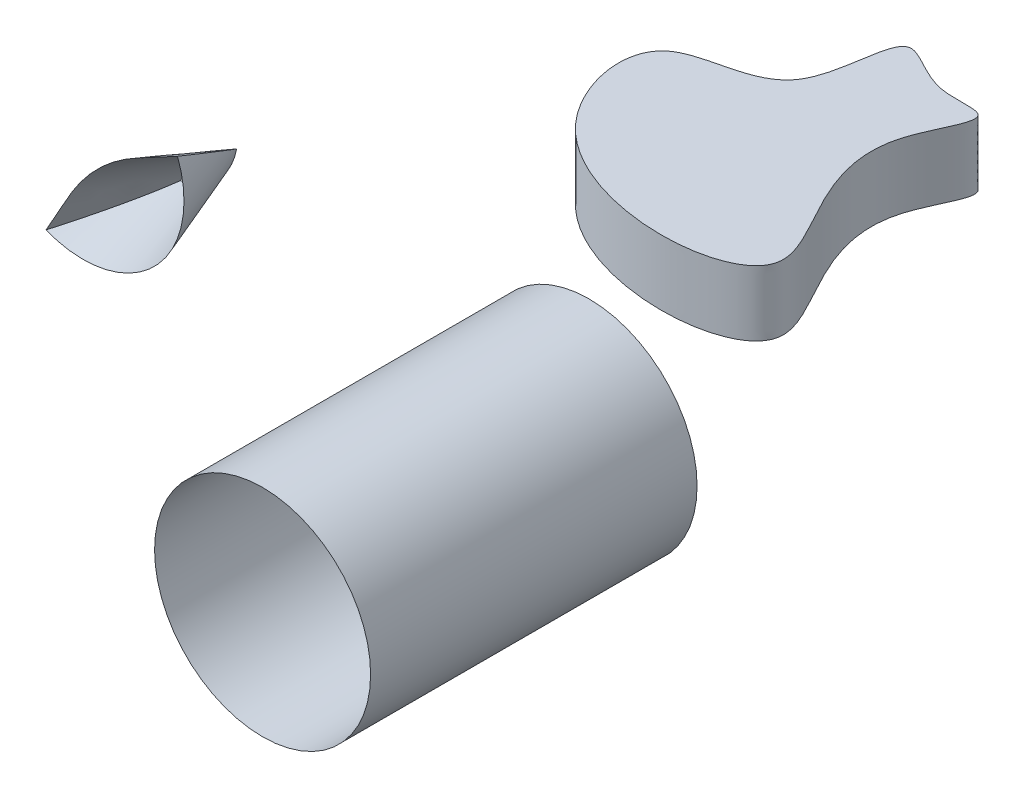
ISO-10303-21;
HEADER;
FILE_DESCRIPTION(('STEP AP214'),'2;1');
FILE_NAME('part.step','',(''),(''),'','','');
FILE_SCHEMA(('AUTOMOTIVE_DESIGN { 1 0 10303 214 1 1 1 1 }'));
ENDSEC;
DATA;
#1=APPLICATION_CONTEXT('core data for automotive mechanical design processes');
#2=APPLICATION_PROTOCOL_DEFINITION('international standard','automotive_design',2000,#1);
#3=PRODUCT_CONTEXT('',#1,'mechanical');
#4=PRODUCT('Part','Part','',(#3));
#5=PRODUCT_RELATED_PRODUCT_CATEGORY('part','',(#4));
#6=PRODUCT_DEFINITION_FORMATION('','',#4);
#7=PRODUCT_DEFINITION_CONTEXT('part definition',#1,'design');
#8=PRODUCT_DEFINITION('design','',#6,#7);
#9=PRODUCT_DEFINITION_SHAPE('','',#8);
#10=(LENGTH_UNIT() NAMED_UNIT(*) SI_UNIT(.MILLI.,.METRE.));
#11=(NAMED_UNIT(*) PLANE_ANGLE_UNIT() SI_UNIT($,.RADIAN.));
#12=(NAMED_UNIT(*) SI_UNIT($,.STERADIAN.) SOLID_ANGLE_UNIT());
#13=UNCERTAINTY_MEASURE_WITH_UNIT(LENGTH_MEASURE(1.E-05),#10,'distance_accuracy_value','');
#14=(GEOMETRIC_REPRESENTATION_CONTEXT(3) GLOBAL_UNCERTAINTY_ASSIGNED_CONTEXT((#13)) GLOBAL_UNIT_ASSIGNED_CONTEXT((#10,
#11,#12)) REPRESENTATION_CONTEXT('',''));
#15=CARTESIAN_POINT('',(0.,0.,0.));
#16=DIRECTION('',(0.,0.,1.));
#17=DIRECTION('',(1.,0.,0.));
#18=AXIS2_PLACEMENT_3D('',#15,#16,#17);
#19=CARTESIAN_POINT('',(-49.1507970621573,10.,-113.553148675584));
#20=CARTESIAN_POINT('',(-55.2439623804513,10.,-104.254853534053));
#21=CARTESIAN_POINT('',(-87.6743060870905,10.,-108.685326320553));
#22=CARTESIAN_POINT('',(-74.0903427954532,10.,-45.4823847950219));
#23=CARTESIAN_POINT('',(27.8354236460612,10.,-48.5070370287409));
#24=CARTESIAN_POINT('',(-32.4402889943373,10.,-97.9136858698389));
#25=CARTESIAN_POINT('',(-5.83480480371106,10.,-134.922849357029));
#26=CARTESIAN_POINT('',(-27.4973487823059,10.,-130.100372673364));
#27=CARTESIAN_POINT('',(-46.7711085310313,10.,-147.96430517599));
#28=CARTESIAN_POINT('',(-43.9525990307988,10.,-121.485705396896));
#29=CARTESIAN_POINT('',(-49.1507970621573,10.,-113.553148675584));
#30=B_SPLINE_CURVE_WITH_KNOTS('',3,(#19,#20,#21,#22,#23,#24,#25,#26,#27,#28,#29),.UNSPECIFIED.,
.T.,.F.,(4,1,1,1,1,1,1,1,4),(0.,0.119358610222687,0.247934810582562,0.506564167676508,
0.71354229957892,0.78558169847103,0.834101116400094,0.898172844445492,1.),.UNSPECIFIED.);
#31=DIRECTION('',(0.,-1.,0.));
#32=VECTOR('',#31,1.);
#33=SURFACE_OF_LINEAR_EXTRUSION('',#30,#32);
#34=CARTESIAN_POINT('',(-49.1507970621573,10.,-113.553148675584));
#35=VERTEX_POINT('',#34);
#36=EDGE_CURVE('E11',#35,#35,#30,.T.);
#37=ORIENTED_EDGE('',*,*,#36,.F.);
#38=EDGE_LOOP('',(#37));
#39=FACE_BOUND('',#38,.T.);
#40=CARTESIAN_POINT('',(-49.1507970621573,-10.,-113.553148675584));
#41=CARTESIAN_POINT('',(-55.2439623804513,-10.,-104.254853534053));
#42=CARTESIAN_POINT('',(-87.6743060870905,-10.,-108.685326320553));
#43=CARTESIAN_POINT('',(-74.0903427954532,-10.,-45.4823847950219));
#44=CARTESIAN_POINT('',(27.8354236460612,-10.,-48.5070370287409));
#45=CARTESIAN_POINT('',(-32.4402889943373,-10.,-97.9136858698389));
#46=CARTESIAN_POINT('',(-5.83480480371106,-10.,-134.922849357029));
#47=CARTESIAN_POINT('',(-27.4973487823059,-10.,-130.100372673364));
#48=CARTESIAN_POINT('',(-46.7711085310313,-10.,-147.96430517599));
#49=CARTESIAN_POINT('',(-43.9525990307988,-10.,-121.485705396896));
#50=CARTESIAN_POINT('',(-49.1507970621573,-10.,-113.553148675584));
#51=B_SPLINE_CURVE_WITH_KNOTS('',3,(#40,#41,#42,#43,#44,#45,#46,#47,#48,#49,#50),.UNSPECIFIED.,
.T.,.F.,(4,1,1,1,1,1,1,1,4),(0.,0.119358610222687,0.247934810582562,0.506564167676508,
0.71354229957892,0.78558169847103,0.834101116400094,0.898172844445492,1.),.UNSPECIFIED.);
#52=CARTESIAN_POINT('',(-49.1507970621573,-10.,-113.553148675584));
#53=VERTEX_POINT('',#52);
#54=EDGE_CURVE('E57',#53,#53,#51,.T.);
#55=ORIENTED_EDGE('',*,*,#54,.T.);
#56=EDGE_LOOP('',(#55));
#57=FACE_BOUND('',#56,.T.);
#58=ADVANCED_FACE('F48',(#39,#57),#33,.F.);
#59=CARTESIAN_POINT('',(-4.4064244063763,10.,-60.2147059790731));
#60=DIRECTION('',(0.,1.,0.));
#61=DIRECTION('',(0.,0.,1.));
#62=AXIS2_PLACEMENT_3D('',#59,#60,#61);
#63=PLANE('',#62);
#64=ORIENTED_EDGE('',*,*,#36,.T.);
#65=EDGE_LOOP('',(#64));
#66=FACE_BOUND('',#65,.T.);
#67=ADVANCED_FACE('F71',(#66),#63,.T.);
#68=CARTESIAN_POINT('',(-4.4064244063763,-10.,-60.2147059790731));
#69=DIRECTION('',(0.,1.,0.));
#70=DIRECTION('',(0.,0.,1.));
#71=AXIS2_PLACEMENT_3D('',#68,#69,#70);
#72=PLANE('',#71);
#73=ORIENTED_EDGE('',*,*,#54,.F.);
#74=EDGE_LOOP('',(#73));
#75=FACE_BOUND('',#74,.T.);
#76=ADVANCED_FACE('F69',(#75),#72,.F.);
#77=CLOSED_SHELL('',(#58,#67,#76));
#78=MANIFOLD_SOLID_BREP('B2',#77);
#79=CARTESIAN_POINT('',(-142.392982890298,-5.58823275927255,31.2));
#80=CARTESIAN_POINT('',(-139.952744756205,-1.25005963740605,31.2));
#81=CARTESIAN_POINT('',(-137.512506622112,3.08811348446046,31.2));
#82=CARTESIAN_POINT('',(-135.072268488019,7.42628660632696,31.2));
#83=CARTESIAN_POINT('',(-133.783813512833,9.71685844191598,31.2));
#84=CARTESIAN_POINT('',(-132.358250288047,11.9015968386679,31.2));
#85=CARTESIAN_POINT('',(-129.233807306659,16.0300214656698,31.2));
#86=CARTESIAN_POINT('',(-127.534788565224,17.9735629796669,31.2));
#87=CARTESIAN_POINT('',(-123.878042005202,21.5895786550206,31.2));
#88=CARTESIAN_POINT('',(-121.920507966322,23.2617555169876,31.2));
#89=CARTESIAN_POINT('',(-117.77440532527,26.3128406256738,31.2));
#90=CARTESIAN_POINT('',(-115.586059553688,27.6917158353275,31.2));
#91=CARTESIAN_POINT('',(-113.298440704203,28.9200612850704,31.2));
#92=CARTESIAN_POINT('',(-108.933573964078,31.2637927157564,31.2));
#93=CARTESIAN_POINT('',(-104.568707223952,33.6075241464424,31.2));
#94=CARTESIAN_POINT('',(-100.203840483827,35.9512555771284,31.2));
#95=CARTESIAN_POINT('',(-131.123550550181,-8.71660057397694,0.));
#96=CARTESIAN_POINT('',(-129.140628436737,-5.19142846300423,0.));
#97=CARTESIAN_POINT('',(-127.157706323292,-1.66625635203152,0.));
#98=CARTESIAN_POINT('',(-125.174784209848,1.85891575894119,0.));
#99=CARTESIAN_POINT('',(-124.127793825271,3.72021998220922,0.));
#100=CARTESIAN_POINT('',(-122.983208084269,5.47153853985969,0.));
#101=CARTESIAN_POINT('',(-120.498845889052,8.75420432402315,0.));
#102=CARTESIAN_POINT('',(-119.159069435075,10.2855515505193,0.));
#103=CARTESIAN_POINT('',(-116.284325813925,13.1282746723414,0.));
#104=CARTESIAN_POINT('',(-114.74935864692,14.4396505676646,0.));
#105=CARTESIAN_POINT('',(-111.484233599815,16.8424310271515,0.));
#106=CARTESIAN_POINT('',(-109.754075719801,17.9338355912992,0.));
#107=CARTESIAN_POINT('',(-107.926322483262,18.9152544898744,0.));
#108=CARTESIAN_POINT('',(-104.438897419807,20.7878403489592,0.));
#109=CARTESIAN_POINT('',(-100.951472356352,22.660426208044,0.));
#110=CARTESIAN_POINT('',(-97.4640472928973,24.5330120671289,0.));
#111=B_SPLINE_SURFACE_WITH_KNOTS('',1,3,((#79,#80,#81,#82,#83,#84,#85,#86,#87,#88,#89,#90,#91,
#92,#93,#94),(#95,#96,#97,#98,#99,#100,#101,#102,#103,#104,#105,#106,#107,#108,#109,#110)),
.UNSPECIFIED.,.F.,.F.,.F.,(2,2),(4,3,2,2,2,3,4),(0.,1.),(0.0373522960338951,0.227568061519548,
0.328002705980897,0.428437350442246,0.528871994903595,0.629306639364944,0.820939891234852),.UNSPECIFIED.);
#112=CARTESIAN_POINT('',(-99.7638494216745,34.0392794720783,26.));
#113=CARTESIAN_POINT('',(-100.464015976382,33.6633224363297,26.));
#114=CARTESIAN_POINT('',(-101.164182531095,33.2873654005934,26.));
#115=CARTESIAN_POINT('',(-102.564439336584,32.5354923008044,26.));
#116=CARTESIAN_POINT('',(-103.264529587359,32.1595762367519,26.));
#117=CARTESIAN_POINT('',(-104.314645852685,31.5957124022844,26.));
#118=CARTESIAN_POINT('',(-104.66467186724,31.4077646318787,26.));
#119=CARTESIAN_POINT('',(-105.364723853206,31.0318691142813,26.));
#120=CARTESIAN_POINT('',(-105.714749824617,30.8439213670896,26.));
#121=CARTESIAN_POINT('',(-106.41687845419,30.4669107878488,26.));
#122=CARTESIAN_POINT('',(-106.768981112352,30.277847955799,26.));
#123=CARTESIAN_POINT('',(-107.473186588512,29.8997222065604,26.));
#124=CARTESIAN_POINT('',(-107.825289406509,29.7106592893717,26.));
#125=CARTESIAN_POINT('',(-108.529514505176,29.3325230018822,26.));
#126=CARTESIAN_POINT('',(-108.881636785846,29.1434496315812,26.));
#127=CARTESIAN_POINT('',(-109.409819902372,28.8598397467809,26.));
#128=CARTESIAN_POINT('',(-109.585880736739,28.7653032295018,26.));
#129=CARTESIAN_POINT('',(-109.938002419791,28.5762301742117,26.));
#130=CARTESIAN_POINT('',(-110.114063268476,28.4816936362008,26.));
#131=CARTESIAN_POINT('',(-110.466203910022,28.2926104378211,26.));
#132=CARTESIAN_POINT('',(-110.642283702884,28.1980637774565,26.));
#133=CARTESIAN_POINT('',(-110.994443137363,28.0089703518088,26.));
#134=CARTESIAN_POINT('',(-111.170522778978,27.9144235865258,26.));
#135=CARTESIAN_POINT('',(-111.434642968054,27.7726035694688,26.));
#136=CARTESIAN_POINT('',(-111.522683407008,27.7253301154358,26.));
#137=CARTESIAN_POINT('',(-111.698763880386,27.6307824755506,26.));
#138=CARTESIAN_POINT('',(-111.786803914809,27.5835082896983,26.));
#139=CARTESIAN_POINT('',(-111.962885617319,27.4889626632438,26.));
#140=CARTESIAN_POINT('',(-112.050927285407,27.4416912226455,26.));
#141=CARTESIAN_POINT('',(-112.182985572625,27.3707761693654,26.));
#142=CARTESIAN_POINT('',(-112.227004306641,27.3471364988844,26.));
#143=CARTESIAN_POINT('',(-112.315049484697,27.2998715179677,26.));
#144=CARTESIAN_POINT('',(-112.359075928738,27.2762462075336,26.));
#145=CARTESIAN_POINT('',(-112.439432429802,27.2330611389107,26.));
#146=CARTESIAN_POINT('',(-112.475767164015,27.2135100991178,26.));
#147=CARTESIAN_POINT('',(-112.548385601054,27.174313560548,26.));
#148=CARTESIAN_POINT('',(-112.584669303941,27.1546680618838,26.));
#149=CARTESIAN_POINT('',(-112.69345458176,27.0956110626666,26.));
#150=CARTESIAN_POINT('',(-112.765890674369,27.0560788716824,26.));
#151=CARTESIAN_POINT('',(-112.910578963505,26.9766825666795,26.));
#152=CARTESIAN_POINT('',(-112.982831163453,26.9368184588961,26.));
#153=CARTESIAN_POINT('',(-113.127152967638,26.8567605053247,26.));
#154=CARTESIAN_POINT('',(-113.199222571113,26.8165666581644,26.));
#155=CARTESIAN_POINT('',(-113.415114344156,26.6955118991166,26.));
#156=CARTESIAN_POINT('',(-113.558659347161,26.614155891594,26.));
#157=CARTESIAN_POINT('',(-113.844996410206,26.4501245704001,26.));
#158=CARTESIAN_POINT('',(-113.987788457652,26.3674492347523,26.));
#159=CARTESIAN_POINT('',(-114.272580080364,26.2007947771054,26.));
#160=CARTESIAN_POINT('',(-114.414579775702,26.1168158603689,26.));
#161=CARTESIAN_POINT('',(-114.697792079352,25.9475446709138,26.));
#162=CARTESIAN_POINT('',(-114.839004693634,25.8622524081744,26.));
#163=CARTESIAN_POINT('',(-115.261435513112,25.6044107921974,26.));
#164=CARTESIAN_POINT('',(-115.541455151852,25.4298916632077,26.));
#165=CARTESIAN_POINT('',(-116.097699032195,25.0759238764394,26.));
#166=CARTESIAN_POINT('',(-116.373928853974,24.8964839816988,26.));
#167=CARTESIAN_POINT('',(-116.923018490017,24.532373952616,26.));
#168=CARTESIAN_POINT('',(-117.195877457577,24.3477025410774,26.));
#169=CARTESIAN_POINT('',(-117.738070683039,23.9731766845659,26.));
#170=CARTESIAN_POINT('',(-118.007404452887,23.7833215329141,26.));
#171=CARTESIAN_POINT('',(-118.542393789021,23.3984801107552,26.));
#172=CARTESIAN_POINT('',(-118.808049224343,23.2034936582644,26.));
#173=CARTESIAN_POINT('',(-119.423800145611,22.7423556498328,26.));
#174=CARTESIAN_POINT('',(-119.772412132999,22.4742192728826,26.));
#175=CARTESIAN_POINT('',(-120.462567977438,21.9291011191702,26.));
#176=CARTESIAN_POINT('',(-120.80411281412,21.6521205820858,26.));
#177=CARTESIAN_POINT('',(-121.479912737031,21.089473665267,26.));
#178=CARTESIAN_POINT('',(-121.814168577724,20.8038081918856,26.));
#179=CARTESIAN_POINT('',(-122.475267708306,20.2238806683032,26.));
#180=CARTESIAN_POINT('',(-122.802109346291,19.92961673512,26.));
#181=CARTESIAN_POINT('',(-123.448118463044,19.3327106990498,26.));
#182=CARTESIAN_POINT('',(-123.767285097069,19.0300676817417,26.));
#183=CARTESIAN_POINT('',(-124.397762516268,18.4165589159116,26.));
#184=CARTESIAN_POINT('',(-124.709071349019,18.1056911623374,26.));
#185=CARTESIAN_POINT('',(-125.42674561671,17.3703504609132,26.));
#186=CARTESIAN_POINT('',(-125.829938276564,16.9427737381747,26.));
#187=CARTESIAN_POINT('',(-126.621604947176,16.074069597164,26.));
#188=CARTESIAN_POINT('',(-127.010076166793,15.6329396376627,26.));
#189=CARTESIAN_POINT('',(-127.771916707112,14.7378695789965,26.));
#190=CARTESIAN_POINT('',(-128.145286893402,14.2839302166022,26.));
#191=CARTESIAN_POINT('',(-128.876566812825,13.3640253983401,26.));
#192=CARTESIAN_POINT('',(-129.234481777973,12.8980640989261,26.));
#193=CARTESIAN_POINT('',(-129.935637531236,11.9535546865491,26.));
#194=CARTESIAN_POINT('',(-130.278842661597,11.4749800800346,26.));
#195=CARTESIAN_POINT('',(-130.781930379693,10.7490427095808,26.));
#196=CARTESIAN_POINT('',(-130.947672245677,10.505718775193,26.));
#197=CARTESIAN_POINT('',(-131.275257567913,10.0164537015825,26.));
#198=CARTESIAN_POINT('',(-131.43710098576,9.77051253661087,26.));
#199=CARTESIAN_POINT('',(-131.75690832097,9.27607438834147,26.));
#200=CARTESIAN_POINT('',(-131.914871701287,9.02757705791688,26.));
#201=CARTESIAN_POINT('',(-132.226898390214,8.52815127647564,26.));
#202=CARTESIAN_POINT('',(-132.380961778143,8.27722287504633,26.));
#203=CARTESIAN_POINT('',(-132.609155060198,7.89904096099538,26.));
#204=CARTESIAN_POINT('',(-132.684745132007,7.77266617763846,26.));
#205=CARTESIAN_POINT('',(-132.834954127431,7.51934126315739,26.));
#206=CARTESIAN_POINT('',(-132.909573055965,7.3923911349518,26.));
#207=CARTESIAN_POINT('',(-133.057836807797,7.13792068009886,26.));
#208=CARTESIAN_POINT('',(-133.131481615856,7.01040034457231,26.));
#209=CARTESIAN_POINT('',(-133.24123414935,6.81871066146994,26.));
#210=CARTESIAN_POINT('',(-133.277699304641,6.75474574286233,26.));
#211=CARTESIAN_POINT('',(-133.350364790226,6.62666558099598,26.));
#212=CARTESIAN_POINT('',(-133.386565120271,6.56255033759592,26.));
#213=CARTESIAN_POINT('',(-133.442851679626,6.46257755837624,26.));
#214=CARTESIAN_POINT('',(-133.462991381048,6.42675005706371,26.));
#215=CARTESIAN_POINT('',(-133.50328345453,6.35510219735455,26.));
#216=CARTESIAN_POINT('',(-133.523435826582,6.31928183895399,26.));
#217=CARTESIAN_POINT('',(-133.583889383807,6.21181894743409,26.));
#218=CARTESIAN_POINT('',(-133.624187088159,6.14017445918802,26.));
#219=CARTESIAN_POINT('',(-133.704784646783,5.99688746998347,26.));
#220=CARTESIAN_POINT('',(-133.745084501034,5.92524496901345,26.));
#221=CARTESIAN_POINT('',(-133.825683582881,5.78195955917424,26.));
#222=CARTESIAN_POINT('',(-133.865982810476,5.71031665030482,26.));
#223=CARTESIAN_POINT('',(-133.986868738475,5.49540923884565,26.));
#224=CARTESIAN_POINT('',(-134.067455617414,5.35214483653635,26.));
#225=CARTESIAN_POINT('',(-134.228629443787,5.06561561171163,26.));
#226=CARTESIAN_POINT('',(-134.309216391221,4.92235078919605,26.));
#227=CARTESIAN_POINT('',(-134.470383648791,4.63583302357462,26.));
#228=CARTESIAN_POINT('',(-134.550963958924,4.49258008046719,26.));
#229=CARTESIAN_POINT('',(-134.712124517721,4.20607428261393,26.));
#230=CARTESIAN_POINT('',(-134.792704766386,4.06282142786812,26.));
#231=CARTESIAN_POINT('',(-135.034443523554,3.63306640504076,26.));
#232=CARTESIAN_POINT('',(-135.195602034511,3.3465642383377,26.));
#233=CARTESIAN_POINT('',(-135.517694176364,2.77395968502174,26.));
#234=CARTESIAN_POINT('',(-135.678627807261,2.4878572984102,26.));
#235=CARTESIAN_POINT('',(-136.000501656427,1.91564081547775,26.));
#236=CARTESIAN_POINT('',(-136.161441874695,1.62952671915684,26.));
#237=CARTESIAN_POINT('',(-136.483326399388,1.05729125843566,26.));
#238=CARTESIAN_POINT('',(-136.644270705812,0.771169894035378,26.));
#239=CARTESIAN_POINT('',(-136.966160908355,0.198924339207895,26.));
#240=CARTESIAN_POINT('',(-137.127106804472,-0.0871998512193073,26.));
#241=CARTESIAN_POINT('',(-137.71672366628,-1.13540083875402,26.));
#242=CARTESIAN_POINT('',(-138.145394631954,-1.89747763586998,26.));
#243=CARTESIAN_POINT('',(-139.002731188425,-3.42162167480272,26.));
#244=CARTESIAN_POINT('',(-139.431396779221,-4.1836889166195,26.));
#245=CARTESIAN_POINT('',(-140.288723659251,-5.70781575308544,26.));
#246=CARTESIAN_POINT('',(-140.717384948485,-6.46987534773461,26.));
#247=CARTESIAN_POINT('',(-141.574704298719,-7.99398879798833,26.));
#248=CARTESIAN_POINT('',(-142.00336235972,-8.7560426535929,26.));
#249=CARTESIAN_POINT('',(-142.860676326816,-10.2801465338828,26.));
#250=CARTESIAN_POINT('',(-143.289332232911,-11.0421965585681,26.));
#251=CARTESIAN_POINT('',(-144.146642963522,-12.5662946851442,26.));
#252=CARTESIAN_POINT('',(-144.575297788037,-13.328342787035,26.));
#253=CARTESIAN_POINT('',(-145.434255177032,-14.855368287395,26.));
#254=CARTESIAN_POINT('',(-145.86455774151,-15.6203456858642,26.));
#255=CARTESIAN_POINT('',(-146.725163947904,-17.150302398234,26.));
#256=CARTESIAN_POINT('',(-147.155467589819,-17.9152817121345,26.));
#257=CARTESIAN_POINT('',(-148.01607703684,-19.445244185581,26.));
#258=CARTESIAN_POINT('',(-148.446382841945,-20.210227345127,26.));
#259=CARTESIAN_POINT('',(-149.306997701096,-21.7401994400783,26.));
#260=CARTESIAN_POINT('',(-149.737306755143,-22.5051883754836,26.));
#261=CARTESIAN_POINT('',(-150.597929197931,-24.0351739523677,26.));
#262=CARTESIAN_POINT('',(-151.028242586672,-24.8001705938464,26.));
#263=CARTESIAN_POINT('',(-151.888874784601,-26.3301735130913,26.));
#264=CARTESIAN_POINT('',(-152.319193593789,-27.0951797908574,26.));
#265=CARTESIAN_POINT('',(-152.749512402976,-27.8601860686235,26.));
#266=B_SPLINE_CURVE_WITH_KNOTS('',3,(#112,#113,#114,#115,#116,#117,#118,#119,#120,#121,#122,
#123,#124,#125,#126,#127,#128,#129,#130,#131,#132,#133,#134,#135,#136,#137,#138,#139,#140,#141,
#142,#143,#144,#145,#146,#147,#148,#149,#150,#151,#152,#153,#154,#155,#156,#157,#158,#159,#160,
#161,#162,#163,#164,#165,#166,#167,#168,#169,#170,#171,#172,#173,#174,#175,#176,#177,#178,#179,
#180,#181,#182,#183,#184,#185,#186,#187,#188,#189,#190,#191,#192,#193,#194,#195,#196,#197,#198,
#199,#200,#201,#202,#203,#204,#205,#206,#207,#208,#209,#210,#211,#212,#213,#214,#215,#216,#217,
#218,#219,#220,#221,#222,#223,#224,#225,#226,#227,#228,#229,#230,#231,#232,#233,#234,#235,#236,
#237,#238,#239,#240,#241,#242,#243,#244,#245,#246,#247,#248,#249,#250,#251,#252,#253,#254,#255,
#256,#257,#258,#259,#260,#261,#262,#263,#264,#265),.UNSPECIFIED.,.F.,.F.,(4,2,2,2,2,2,2,2,2,2,2,
2,2,2,2,2,2,2,2,2,2,2,2,2,2,2,2,2,2,2,2,2,2,2,2,2,2,2,2,2,2,2,2,2,2,2,2,2,2,2,2,2,2,2,2,2,2,2,2,
2,2,2,2,2,2,2,2,2,2,2,2,2,2,2,2,2,4),(0.,2.38415437284063,4.76804892126061,5.95993112072214,
7.15181317320403,8.35076660312841,9.54972057634054,10.7487408260033,11.3482499038967,
11.947759049046,12.5473326308626,13.1469059616394,13.446694362411,13.7464827316473,
14.0462715262626,14.1961659741683,14.346060438569,14.4698428399302,14.5936250934464,
14.84118841364,15.0887470934783,15.3363068040764,15.8312897936396,16.3262810368833,
16.8211951135653,17.3161054315599,18.3058966779263,19.2940270728942,20.2824008201413,
21.2709099879598,22.2594542610284,23.5787136643079,24.8977889530328,26.2167270534846,
27.5359561862733,28.8553298602947,30.1750281941931,31.9377548904539,33.7008141392441,
35.4637721863607,37.2261286687205,38.9925400587102,39.875737904338,40.7589444471448,
41.6422725556846,42.5255826844736,42.9673483287562,43.4091117345842,43.8508820436255,
44.0717683061208,44.2926547763481,44.4159550640892,44.5392552838152,44.7858552454368,
45.0324531676243,45.2790512360664,45.7721743505345,46.265298664741,46.7583821554351,
47.2514653247007,48.2376194782742,49.2223975662763,50.2072159605642,51.1920593716863,
52.1769125101911,54.8000172686088,57.4230891372482,60.0461346839663,62.6691604766199,
65.2921730830661,67.9151790711617,70.5482678380831,73.1813631980109,75.8144717948338,
78.4476002724409,81.0807552747208,83.7139434455627),.UNSPECIFIED.);
#267=CARTESIAN_POINT('',(-140.341529780069,-5.80169269517613,25.9999999999999));
#268=VERTEX_POINT('',#267);
#269=CARTESIAN_POINT('',(-100.054025517527,33.883468338139,25.9999999999992));
#270=VERTEX_POINT('',#269);
#271=EDGE_CURVE('E116',#268,#270,#266,.F.);
#272=CARTESIAN_POINT('',(-99.5759547944707,35.1899718158877,28.5411459921375));
#273=CARTESIAN_POINT('',(-99.6755700169655,34.9106569623694,27.9945121823519));
#274=CARTESIAN_POINT('',(-99.7770643455612,34.6306249908726,27.4485848842064));
#275=CARTESIAN_POINT('',(-99.9840404048785,34.0690447574924,26.3582425797368));
#276=CARTESIAN_POINT('',(-100.089522281327,33.7874964405165,25.8138276294642));
#277=CARTESIAN_POINT('',(-100.304696452716,33.2228190483044,24.7266438351649));
#278=CARTESIAN_POINT('',(-100.414388789969,32.9396899572067,24.18387500774));
#279=CARTESIAN_POINT('',(-100.638391263696,32.3713797072984,23.0993721015684));
#280=CARTESIAN_POINT('',(-100.752707614941,32.0861962408119,22.5576405145061));
#281=CARTESIAN_POINT('',(-100.986091138361,31.5140848795517,21.4761296546644));
#282=CARTESIAN_POINT('',(-101.105158274118,31.2271569981649,20.9363503669531));
#283=CARTESIAN_POINT('',(-101.348350822104,30.6514612790531,19.8589124857543));
#284=CARTESIAN_POINT('',(-101.47247625426,30.3626934340837,19.3212539006301));
#285=CARTESIAN_POINT('',(-101.727648017328,29.7797362519791,18.2418089120115));
#286=CARTESIAN_POINT('',(-101.858759604318,29.4855234700206,17.7000505745332));
#287=CARTESIAN_POINT('',(-102.12689960721,28.8950001682151,16.6191465107244));
#288=CARTESIAN_POINT('',(-102.263928016631,28.5986896506671,16.0800007815319));
#289=CARTESIAN_POINT('',(-102.544336164037,28.003850600023,15.0045955307773));
#290=CARTESIAN_POINT('',(-102.68771585225,27.7053220843238,14.4683359866343));
#291=CARTESIAN_POINT('',(-102.981198372662,27.1061511892575,13.3994384820715));
#292=CARTESIAN_POINT('',(-103.1312957403,26.8055106899085,12.8667979698639));
#293=CARTESIAN_POINT('',(-103.438870070227,26.2017320567053,11.805062795461));
#294=CARTESIAN_POINT('',(-103.596347115926,25.8985938946524,11.2759681734212));
#295=CARTESIAN_POINT('',(-103.919308110682,25.2896497025397,10.2217280561354));
#296=CARTESIAN_POINT('',(-104.084792485739,24.9838435312491,9.69658277272071));
#297=CARTESIAN_POINT('',(-104.425960696814,24.3667034753495,8.64616857437082));
#298=CARTESIAN_POINT('',(-104.601721494225,24.0553446280714,8.12093926532537));
#299=CARTESIAN_POINT('',(-104.96292200598,23.4295754921311,7.07567449437412));
#300=CARTESIAN_POINT('',(-105.14836134184,23.1151653231831,6.55563883031444));
#301=CARTESIAN_POINT('',(-105.529853973247,22.4831144406893,5.52154313290258));
#302=CARTESIAN_POINT('',(-105.725905948697,22.1654741329112,5.00748236595721));
#303=CARTESIAN_POINT('',(-106.130109008255,21.5261302730561,3.98525115263627));
#304=CARTESIAN_POINT('',(-106.338281265031,21.2044204287404,3.47709299442997));
#305=CARTESIAN_POINT('',(-106.767719494681,20.5572221274909,2.468648716248));
#306=CARTESIAN_POINT('',(-106.988987041205,20.2317332202234,1.968363551545));
#307=CARTESIAN_POINT('',(-107.331873459918,19.740445849109,1.22482114125323));
#308=CARTESIAN_POINT('',(-107.448031893536,19.5761306164539,0.97805700437845));
#309=CARTESIAN_POINT('',(-107.684219505733,19.2464712757712,0.487069232519833));
#310=CARTESIAN_POINT('',(-107.804248808622,19.0811271348394,0.242845679457278));
#311=CARTESIAN_POINT('',(-107.926322483262,18.9152544898744,0.));
#312=B_SPLINE_CURVE_WITH_KNOTS('',3,(#272,#273,#274,#275,#276,#277,#278,#279,#280,#281,#282,
#283,#284,#285,#286,#287,#288,#289,#290,#291,#292,#293,#294,#295,#296,#297,#298,#299,#300,#301,
#302,#303,#304,#305,#306,#307,#308,#309,#310,#311),.UNSPECIFIED.,.F.,.F.,(4,2,2,2,2,2,2,2,2,2,2,
2,2,2,2,2,2,2,2,4),(0.,1.8656726080083,3.73141346393968,5.59717307458371,7.46552953736405,
9.33387168009962,11.2022211835975,13.0930285168536,14.9838337783756,16.8746242250413,
18.7639035942895,20.6532043227669,22.54260567543,24.4486392697203,26.3545983834293,
28.2603209590058,30.1694787668233,32.0788664642068,33.0340646887441,33.9892936188251),.UNSPECIFIED.);
#313=CARTESIAN_POINT('',(-107.926322483262,18.9152544898744,0.));
#314=VERTEX_POINT('',#313);
#315=EDGE_CURVE('E138',#314,#270,#312,.F.);
#316=CARTESIAN_POINT('',(-130.788535591325,-12.4872918381842,0.));
#317=CARTESIAN_POINT('',(-121.756976328997,22.7553634718287,0.));
#318=CARTESIAN_POINT('',(-83.6996760118903,25.2872878244394,0.));
#319=B_SPLINE_CURVE_WITH_KNOTS('',2,(#316,#317,#318),.UNSPECIFIED.,.F.,.F.,(3,3),(0.,1.),.UNSPECIFIED.);
#320=CARTESIAN_POINT('',(-125.174784209848,1.85891575894137,0.));
#321=VERTEX_POINT('',#320);
#322=EDGE_CURVE('E46',#321,#314,#319,.T.);
#323=CARTESIAN_POINT('',(-141.093908679003,-6.06526671399489,27.446638260572));
#324=CARTESIAN_POINT('',(-140.821324303001,-5.97123091939587,26.9205645436573));
#325=CARTESIAN_POINT('',(-140.548012114007,-5.87538242058808,26.3951896749754));
#326=CARTESIAN_POINT('',(-139.999849768918,-5.67984144563268,25.3459348673196));
#327=CARTESIAN_POINT('',(-139.724999556533,-5.5801488279961,24.8220549841347));
#328=CARTESIAN_POINT('',(-139.173696098052,-5.37670691047375,23.7759208480159));
#329=CARTESIAN_POINT('',(-138.897242835703,-5.27295756939356,23.253666611648));
#330=CARTESIAN_POINT('',(-138.342277355452,-5.06101771471271,22.210209908758));
#331=CARTESIAN_POINT('',(-138.063762838135,-4.95282131934349,21.6890098586568));
#332=CARTESIAN_POINT('',(-137.504966221025,-4.73185760610356,20.6485340308295));
#333=CARTESIAN_POINT('',(-137.22468413499,-4.61909032377421,20.1292582381754));
#334=CARTESIAN_POINT('',(-136.662256597095,-4.3886928163056,19.0927949074578));
#335=CARTESIAN_POINT('',(-136.380111138262,-4.27106257296023,18.5756073772204));
#336=CARTESIAN_POINT('',(-135.8104193025,-4.02915838286577,17.5372481048238));
#337=CARTESIAN_POINT('',(-135.522848946851,-3.90482110234763,17.0161042523377));
#338=CARTESIAN_POINT('',(-134.945585297605,-3.65046683959347,15.9763833873523));
#339=CARTESIAN_POINT('',(-134.655892005935,-3.52044986250892,15.4578063725254));
#340=CARTESIAN_POINT('',(-134.074261887,-3.25432531444419,14.4234838630163));
#341=CARTESIAN_POINT('',(-133.782325076252,-3.11821778826745,13.9077383475362));
#342=CARTESIAN_POINT('',(-133.196302302596,-2.83955977876693,12.8797794793386));
#343=CARTESIAN_POINT('',(-132.902218202546,-2.69701442650142,12.3675636759991));
#344=CARTESIAN_POINT('',(-132.311527184972,-2.40486386979618,11.3466003921457));
#345=CARTESIAN_POINT('',(-132.014920240197,-2.25525858901536,10.8378529492044));
#346=CARTESIAN_POINT('',(-131.419014267348,-1.94839900545604,9.82421466190745));
#347=CARTESIAN_POINT('',(-131.119715102536,-1.79114431235595,9.31932401587423));
#348=CARTESIAN_POINT('',(-130.515638909354,-1.46692068018765,8.30951024082789));
#349=CARTESIAN_POINT('',(-130.210836866071,-1.29987881875311,7.80462543591781));
#350=CARTESIAN_POINT('',(-129.59815613239,-0.956579737367005,6.79990137343599));
#351=CARTESIAN_POINT('',(-129.2902775575,-0.780322862347063,6.30006192784336));
#352=CARTESIAN_POINT('',(-128.671263718158,-0.417722884283407,5.30617049990785));
#353=CARTESIAN_POINT('',(-128.360128846214,-0.231380985829202,4.81211783490955));
#354=CARTESIAN_POINT('',(-127.733795855339,0.152767527598255,3.82972536910613));
#355=CARTESIAN_POINT('',(-127.418591533304,0.350593799957488,3.34139719242578));
#356=CARTESIAN_POINT('',(-126.784383641961,0.75862734031607,2.37232010224565));
#357=CARTESIAN_POINT('',(-126.46537963554,0.968836043977032,1.89157207583848));
#358=CARTESIAN_POINT('',(-125.98380599945,1.29450531459874,1.1770539052043));
#359=CARTESIAN_POINT('',(-125.822728969491,1.40481704580516,0.939922564127728));
#360=CARTESIAN_POINT('',(-125.499539993977,1.6290838724403,0.46808921058904));
#361=CARTESIAN_POINT('',(-125.337428017118,1.74303907850179,0.233387272181843));
#362=CARTESIAN_POINT('',(-125.174784209848,1.85891575894119,0.));
#363=B_SPLINE_CURVE_WITH_KNOTS('',3,(#323,#324,#325,#326,#327,#328,#329,#330,#331,#332,#333,
#334,#335,#336,#337,#338,#339,#340,#341,#342,#343,#344,#345,#346,#347,#348,#349,#350,#351,#352,
#353,#354,#355,#356,#357,#358,#359,#360,#361,#362),.UNSPECIFIED.,.F.,.F.,(4,2,2,2,2,2,2,2,2,2,2,
2,2,2,2,2,2,2,2,4),(0.,1.79974567914111,3.5995576641647,5.39938793031371,7.20168053897619,
9.00395913643237,10.8062444819302,12.6304169516519,14.4545877668924,16.2787451653299,
18.1014734875248,19.9242215239313,21.7470626662804,23.5858438586558,25.4245562719328,
27.2630495457719,29.1047882124698,30.9467408385931,31.8681843431778,32.78965585368),.UNSPECIFIED.);
#364=EDGE_CURVE('E133',#321,#268,#363,.F.);
#365=ORIENTED_EDGE('',*,*,#271,.T.);
#366=ORIENTED_EDGE('',*,*,#315,.F.);
#367=ORIENTED_EDGE('',*,*,#322,.F.);
#368=ORIENTED_EDGE('',*,*,#364,.T.);
#369=EDGE_LOOP('',(#365,#366,#367,#368));
#370=FACE_BOUND('',#369,.T.);
#371=ADVANCED_FACE('F107',(#370),#111,.F.);
#372=CARTESIAN_POINT('',(-129.013264904167,22.9901769544903,0.));
#373=DIRECTION('',(0.,0.,1.));
#374=DIRECTION('',(1.,0.,0.));
#375=AXIS2_PLACEMENT_3D('',#372,#373,#374);
#376=CONICAL_SURFACE('',#375,21.4770606404873,0.349065850398867);
#377=CARTESIAN_POINT('',(-129.013264904167,22.9901769544903,26.));
#378=DIRECTION('',(0.,0.,-1.));
#379=DIRECTION('',(-1.,0.,0.));
#380=AXIS2_PLACEMENT_3D('',#377,#378,#379);
#381=CIRCLE('',#380,30.9402867314086);
#382=EDGE_CURVE('E110',#268,#270,#381,.F.);
#383=ORIENTED_EDGE('',*,*,#382,.F.);
#384=ORIENTED_EDGE('',*,*,#364,.F.);
#385=CARTESIAN_POINT('',(-129.013264904167,22.9901769544903,0.));
#386=DIRECTION('',(0.,0.,1.));
#387=DIRECTION('',(1.,0.,0.));
#388=AXIS2_PLACEMENT_3D('',#385,#386,#387);
#389=CIRCLE('',#388,21.4770606404873);
#390=EDGE_CURVE('E125',#321,#314,#389,.T.);
#391=ORIENTED_EDGE('',*,*,#390,.T.);
#392=ORIENTED_EDGE('',*,*,#315,.T.);
#393=EDGE_LOOP('',(#383,#384,#391,#392));
#394=FACE_BOUND('',#393,.T.);
#395=ADVANCED_FACE('F140',(#394),#376,.T.);
#396=OPEN_SHELL('',(#371,#395));
#397=SHELL_BASED_SURFACE_MODEL('B6',(#396));
#398=CARTESIAN_POINT('',(0.,0.,0.));
#399=DIRECTION('',(0.,0.,1.));
#400=DIRECTION('',(1.,0.,0.));
#401=AXIS2_PLACEMENT_3D('',#398,#399,#400);
#402=CYLINDRICAL_SURFACE('',#401,33.0882398077296);
#403=CARTESIAN_POINT('',(0.,0.,0.));
#404=DIRECTION('',(0.,0.,1.));
#405=DIRECTION('',(1.,0.,0.));
#406=AXIS2_PLACEMENT_3D('',#403,#404,#405);
#407=CIRCLE('',#406,33.0882398077296);
#408=CARTESIAN_POINT('',(33.0882398077296,0.,0.));
#409=VERTEX_POINT('',#408);
#410=EDGE_CURVE('E200',#409,#409,#407,.T.);
#411=ORIENTED_EDGE('',*,*,#410,.T.);
#412=EDGE_LOOP('',(#411));
#413=FACE_BOUND('',#412,.T.);
#414=CARTESIAN_POINT('',(0.,0.,100.));
#415=DIRECTION('',(0.,0.,1.));
#416=DIRECTION('',(1.,0.,0.));
#417=AXIS2_PLACEMENT_3D('',#414,#415,#416);
#418=CIRCLE('',#417,33.0882398077296);
#419=CARTESIAN_POINT('',(33.0882398077296,0.,100.));
#420=VERTEX_POINT('',#419);
#421=EDGE_CURVE('E106',#420,#420,#418,.T.);
#422=ORIENTED_EDGE('',*,*,#421,.F.);
#423=EDGE_LOOP('',(#422));
#424=FACE_BOUND('',#423,.T.);
#425=ADVANCED_FACE('F196',(#413,#424),#402,.T.);
#426=OPEN_SHELL('',(#425));
#427=SHELL_BASED_SURFACE_MODEL('B40',(#426));
#428=ADVANCED_BREP_SHAPE_REPRESENTATION('',(#18,#78),#14);
#429=MANIFOLD_SURFACE_SHAPE_REPRESENTATION('',(#18,#397,#427),#14);
#430=SHAPE_REPRESENTATION('',(#18),#14);
#431=SHAPE_DEFINITION_REPRESENTATION(#9,#430);
#432=SHAPE_REPRESENTATION_RELATIONSHIP('','',#430,#428);
#433=SHAPE_REPRESENTATION_RELATIONSHIP('','',#430,#429);
ENDSEC;
END-ISO-10303-21;
